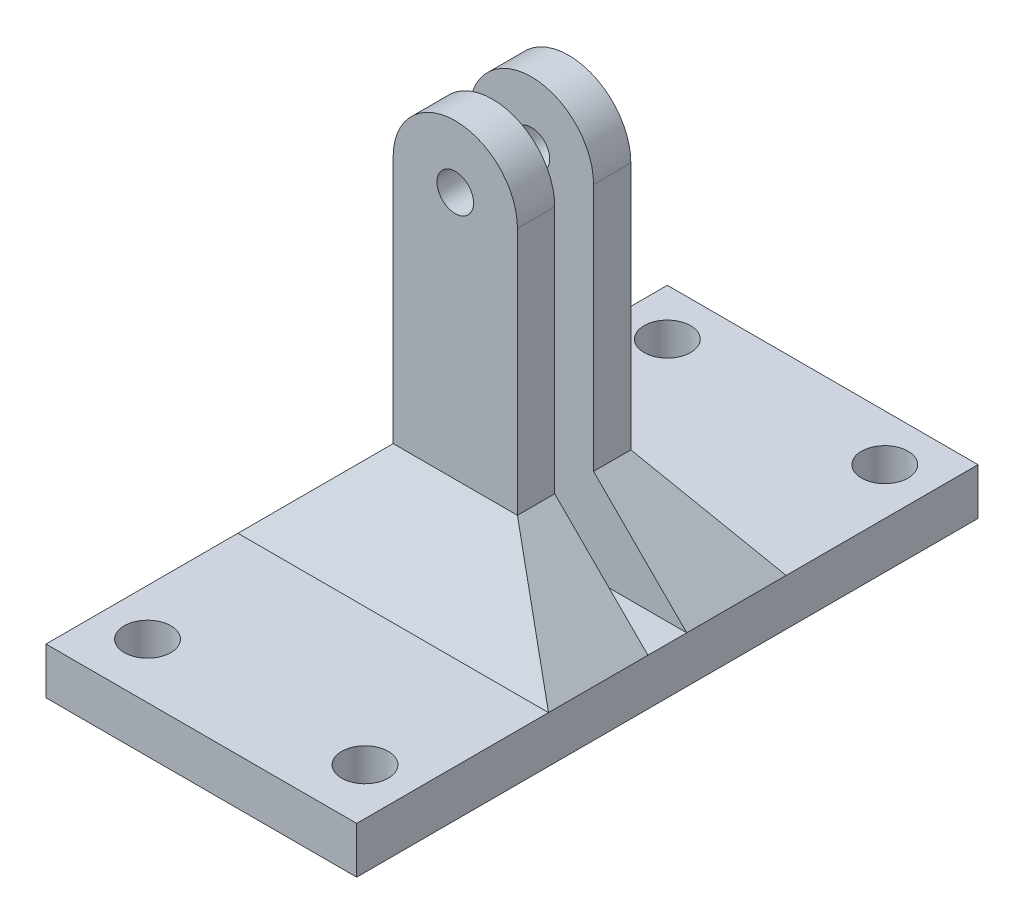
ISO-10303-21;
HEADER;
FILE_DESCRIPTION(('STEP AP214'),'2;1');
FILE_NAME('part.step','',(''),(''),'','','');
FILE_SCHEMA(('AUTOMOTIVE_DESIGN { 1 0 10303 214 1 1 1 1 }'));
ENDSEC;
DATA;
#1=APPLICATION_CONTEXT('core data for automotive mechanical design processes');
#2=APPLICATION_PROTOCOL_DEFINITION('international standard','automotive_design',2000,#1);
#3=PRODUCT_CONTEXT('',#1,'mechanical');
#4=PRODUCT('Part','Part','',(#3));
#5=PRODUCT_RELATED_PRODUCT_CATEGORY('part','',(#4));
#6=PRODUCT_DEFINITION_FORMATION('','',#4);
#7=PRODUCT_DEFINITION_CONTEXT('part definition',#1,'design');
#8=PRODUCT_DEFINITION('design','',#6,#7);
#9=PRODUCT_DEFINITION_SHAPE('','',#8);
#10=(LENGTH_UNIT() NAMED_UNIT(*) SI_UNIT(.MILLI.,.METRE.));
#11=(NAMED_UNIT(*) PLANE_ANGLE_UNIT() SI_UNIT($,.RADIAN.));
#12=(NAMED_UNIT(*) SI_UNIT($,.STERADIAN.) SOLID_ANGLE_UNIT());
#13=UNCERTAINTY_MEASURE_WITH_UNIT(LENGTH_MEASURE(1.E-05),#10,'distance_accuracy_value','');
#14=(GEOMETRIC_REPRESENTATION_CONTEXT(3) GLOBAL_UNCERTAINTY_ASSIGNED_CONTEXT((#13)) GLOBAL_UNIT_ASSIGNED_CONTEXT((#10,
#11,#12)) REPRESENTATION_CONTEXT('',''));
#15=CARTESIAN_POINT('',(0.,0.,0.));
#16=DIRECTION('',(0.,0.,1.));
#17=DIRECTION('',(1.,0.,0.));
#18=AXIS2_PLACEMENT_3D('',#15,#16,#17);
#19=CARTESIAN_POINT('',(0.,0.,-1.25));
#20=DIRECTION('',(0.,0.,-1.));
#21=DIRECTION('',(0.,1.,0.));
#22=AXIS2_PLACEMENT_3D('',#19,#20,#21);
#23=PLANE('',#22);
#24=CARTESIAN_POINT('',(0.,25.,-1.25));
#25=DIRECTION('',(0.,0.,-1.));
#26=DIRECTION('',(0.,1.,0.));
#27=AXIS2_PLACEMENT_3D('',#24,#25,#26);
#28=CIRCLE('',#27,1.17867972849522);
#29=CARTESIAN_POINT('',(0.,26.1786797284952,-1.25));
#30=VERTEX_POINT('',#29);
#31=EDGE_CURVE('E658',#30,#30,#28,.T.);
#32=ORIENTED_EDGE('',*,*,#31,.T.);
#33=EDGE_LOOP('',(#32));
#34=FACE_BOUND('',#33,.T.);
#35=CARTESIAN_POINT('',(0.,25.,-1.25));
#36=DIRECTION('',(0.,0.,-1.));
#37=DIRECTION('',(0.,1.,0.));
#38=AXIS2_PLACEMENT_3D('',#35,#36,#37);
#39=CIRCLE('',#38,4.);
#40=CARTESIAN_POINT('',(-4.,25.,-1.25));
#41=VERTEX_POINT('',#40);
#42=CARTESIAN_POINT('',(4.,25.,-1.25));
#43=VERTEX_POINT('',#42);
#44=EDGE_CURVE('E674',#41,#43,#39,.T.);
#45=ORIENTED_EDGE('',*,*,#44,.F.);
#46=DIRECTION('',(0.,-1.,0.));
#47=VECTOR('',#46,1.);
#48=CARTESIAN_POINT('',(-4.,29.,-1.25));
#49=LINE('',#48,#47);
#50=CARTESIAN_POINT('',(-4.,9.,-1.25));
#51=VERTEX_POINT('',#50);
#52=EDGE_CURVE('E243',#41,#51,#49,.T.);
#53=ORIENTED_EDGE('',*,*,#52,.T.);
#54=DIRECTION('',(0.707106781186547,0.707106781186547,0.));
#55=VECTOR('',#54,1.);
#56=CARTESIAN_POINT('',(-10.,3.,-1.25));
#57=LINE('',#56,#55);
#58=CARTESIAN_POINT('',(-10.,3.,-1.25));
#59=VERTEX_POINT('',#58);
#60=EDGE_CURVE('E453',#59,#51,#57,.T.);
#61=ORIENTED_EDGE('',*,*,#60,.F.);
#62=DIRECTION('',(1.,0.,0.));
#63=VECTOR('',#62,1.);
#64=CARTESIAN_POINT('',(-10.,3.,-1.25));
#65=LINE('',#64,#63);
#66=CARTESIAN_POINT('',(10.,3.,-1.25));
#67=VERTEX_POINT('',#66);
#68=EDGE_CURVE('E515',#59,#67,#65,.T.);
#69=ORIENTED_EDGE('',*,*,#68,.T.);
#70=DIRECTION('',(-0.707106781186547,0.707106781186547,0.));
#71=VECTOR('',#70,1.);
#72=CARTESIAN_POINT('',(10.,3.,-1.25));
#73=LINE('',#72,#71);
#74=CARTESIAN_POINT('',(4.,9.,-1.25));
#75=VERTEX_POINT('',#74);
#76=EDGE_CURVE('E333',#67,#75,#73,.T.);
#77=ORIENTED_EDGE('',*,*,#76,.T.);
#78=DIRECTION('',(0.,-1.,0.));
#79=VECTOR('',#78,1.);
#80=CARTESIAN_POINT('',(4.,29.,-1.25));
#81=LINE('',#80,#79);
#82=EDGE_CURVE('E258',#43,#75,#81,.T.);
#83=ORIENTED_EDGE('',*,*,#82,.F.);
#84=EDGE_LOOP('',(#45,#53,#61,#69,#77,#83));
#85=FACE_BOUND('',#84,.T.);
#86=ADVANCED_FACE('F105',(#34,#85),#23,.F.);
#87=CARTESIAN_POINT('',(0.,0.,1.25));
#88=DIRECTION('',(0.,0.,1.));
#89=DIRECTION('',(0.,1.,0.));
#90=AXIS2_PLACEMENT_3D('',#87,#88,#89);
#91=PLANE('',#90);
#92=CARTESIAN_POINT('',(0.,25.,1.25));
#93=DIRECTION('',(0.,0.,1.));
#94=DIRECTION('',(0.,-1.,0.));
#95=AXIS2_PLACEMENT_3D('',#92,#93,#94);
#96=CIRCLE('',#95,1.17867972849522);
#97=CARTESIAN_POINT('',(0.,23.8213202715048,1.25));
#98=VERTEX_POINT('',#97);
#99=EDGE_CURVE('E245',#98,#98,#96,.T.);
#100=ORIENTED_EDGE('',*,*,#99,.T.);
#101=EDGE_LOOP('',(#100));
#102=FACE_BOUND('',#101,.T.);
#103=DIRECTION('',(0.,-1.,0.));
#104=VECTOR('',#103,1.);
#105=CARTESIAN_POINT('',(-4.,29.,1.25));
#106=LINE('',#105,#104);
#107=CARTESIAN_POINT('',(-4.,25.,1.25));
#108=VERTEX_POINT('',#107);
#109=CARTESIAN_POINT('',(-4.,9.,1.25));
#110=VERTEX_POINT('',#109);
#111=EDGE_CURVE('E110',#108,#110,#106,.T.);
#112=ORIENTED_EDGE('',*,*,#111,.F.);
#113=CARTESIAN_POINT('',(0.,25.,1.25));
#114=DIRECTION('',(0.,0.,1.));
#115=DIRECTION('',(0.,-1.,0.));
#116=AXIS2_PLACEMENT_3D('',#113,#114,#115);
#117=CIRCLE('',#116,4.);
#118=CARTESIAN_POINT('',(4.,25.,1.25));
#119=VERTEX_POINT('',#118);
#120=EDGE_CURVE('E236',#119,#108,#117,.T.);
#121=ORIENTED_EDGE('',*,*,#120,.F.);
#122=DIRECTION('',(0.,-1.,0.));
#123=VECTOR('',#122,1.);
#124=CARTESIAN_POINT('',(4.,29.,1.25));
#125=LINE('',#124,#123);
#126=CARTESIAN_POINT('',(4.,9.,1.25));
#127=VERTEX_POINT('',#126);
#128=EDGE_CURVE('E260',#119,#127,#125,.T.);
#129=ORIENTED_EDGE('',*,*,#128,.T.);
#130=DIRECTION('',(-0.707106781186547,0.707106781186547,0.));
#131=VECTOR('',#130,1.);
#132=CARTESIAN_POINT('',(10.,3.,1.25));
#133=LINE('',#132,#131);
#134=CARTESIAN_POINT('',(10.,3.,1.25));
#135=VERTEX_POINT('',#134);
#136=EDGE_CURVE('E401',#135,#127,#133,.T.);
#137=ORIENTED_EDGE('',*,*,#136,.F.);
#138=DIRECTION('',(1.,0.,0.));
#139=VECTOR('',#138,1.);
#140=CARTESIAN_POINT('',(0.,3.,1.25));
#141=LINE('',#140,#139);
#142=CARTESIAN_POINT('',(-10.,3.,1.25));
#143=VERTEX_POINT('',#142);
#144=EDGE_CURVE('E134',#143,#135,#141,.T.);
#145=ORIENTED_EDGE('',*,*,#144,.F.);
#146=DIRECTION('',(0.707106781186547,0.707106781186547,0.));
#147=VECTOR('',#146,1.);
#148=CARTESIAN_POINT('',(-10.,3.,1.25));
#149=LINE('',#148,#147);
#150=EDGE_CURVE('E407',#143,#110,#149,.T.);
#151=ORIENTED_EDGE('',*,*,#150,.T.);
#152=EDGE_LOOP('',(#112,#121,#129,#137,#145,#151));
#153=FACE_BOUND('',#152,.T.);
#154=ADVANCED_FACE('F372',(#102,#153),#91,.F.);
#155=CARTESIAN_POINT('',(-4.,29.,3.65));
#156=DIRECTION('',(0.,0.,-1.));
#157=DIRECTION('',(-1.,0.,0.));
#158=AXIS2_PLACEMENT_3D('',#155,#156,#157);
#159=PLANE('',#158);
#160=CARTESIAN_POINT('',(0.,25.,3.65));
#161=DIRECTION('',(0.,0.,1.));
#162=DIRECTION('',(1.,0.,0.));
#163=AXIS2_PLACEMENT_3D('',#160,#161,#162);
#164=CIRCLE('',#163,1.17867972849522);
#165=CARTESIAN_POINT('',(1.17867972849522,25.,3.65));
#166=VERTEX_POINT('',#165);
#167=EDGE_CURVE('E770',#166,#166,#164,.T.);
#168=ORIENTED_EDGE('',*,*,#167,.F.);
#169=EDGE_LOOP('',(#168));
#170=FACE_BOUND('',#169,.T.);
#171=CARTESIAN_POINT('',(0.,25.,3.65));
#172=DIRECTION('',(0.,0.,1.));
#173=DIRECTION('',(1.,0.,0.));
#174=AXIS2_PLACEMENT_3D('',#171,#172,#173);
#175=CIRCLE('',#174,4.);
#176=CARTESIAN_POINT('',(4.,25.,3.65));
#177=VERTEX_POINT('',#176);
#178=CARTESIAN_POINT('',(-4.,25.,3.65));
#179=VERTEX_POINT('',#178);
#180=EDGE_CURVE('E661',#177,#179,#175,.T.);
#181=ORIENTED_EDGE('',*,*,#180,.T.);
#182=DIRECTION('',(0.,-1.,0.));
#183=VECTOR('',#182,1.);
#184=CARTESIAN_POINT('',(-4.,29.,3.65));
#185=LINE('',#184,#183);
#186=CARTESIAN_POINT('',(-4.,9.,3.65));
#187=VERTEX_POINT('',#186);
#188=EDGE_CURVE('E265',#179,#187,#185,.T.);
#189=ORIENTED_EDGE('',*,*,#188,.T.);
#190=CARTESIAN_POINT('',(-4.,9.,3.65));
#191=DIRECTION('',(1.,0.,0.));
#192=VECTOR('',#191,1.);
#193=LINE('',#190,#192);
#194=CARTESIAN_POINT('',(4.,9.,3.65));
#195=VERTEX_POINT('',#194);
#196=EDGE_CURVE('E398',#187,#195,#193,.T.);
#197=ORIENTED_EDGE('',*,*,#196,.T.);
#198=DIRECTION('',(0.,-1.,0.));
#199=VECTOR('',#198,1.);
#200=CARTESIAN_POINT('',(4.,29.,3.65));
#201=LINE('',#200,#199);
#202=EDGE_CURVE('E343',#177,#195,#201,.T.);
#203=ORIENTED_EDGE('',*,*,#202,.F.);
#204=EDGE_LOOP('',(#181,#189,#197,#203));
#205=FACE_BOUND('',#204,.T.);
#206=ADVANCED_FACE('F290',(#170,#205),#159,.F.);
#207=CARTESIAN_POINT('',(-4.,29.,-3.65));
#208=DIRECTION('',(0.,0.,1.));
#209=DIRECTION('',(1.,0.,0.));
#210=AXIS2_PLACEMENT_3D('',#207,#208,#209);
#211=PLANE('',#210);
#212=CARTESIAN_POINT('',(0.,25.,-3.65));
#213=DIRECTION('',(0.,0.,1.));
#214=DIRECTION('',(1.,0.,0.));
#215=AXIS2_PLACEMENT_3D('',#212,#213,#214);
#216=CIRCLE('',#215,1.17867972849522);
#217=CARTESIAN_POINT('',(1.17867972849522,25.,-3.65));
#218=VERTEX_POINT('',#217);
#219=EDGE_CURVE('E766',#218,#218,#216,.F.);
#220=ORIENTED_EDGE('',*,*,#219,.F.);
#221=EDGE_LOOP('',(#220));
#222=FACE_BOUND('',#221,.T.);
#223=DIRECTION('',(0.,-1.,0.));
#224=VECTOR('',#223,1.);
#225=CARTESIAN_POINT('',(-4.,29.,-3.65));
#226=LINE('',#225,#224);
#227=CARTESIAN_POINT('',(-4.,25.,-3.65));
#228=VERTEX_POINT('',#227);
#229=CARTESIAN_POINT('',(-4.,9.,-3.65));
#230=VERTEX_POINT('',#229);
#231=EDGE_CURVE('E241',#228,#230,#226,.T.);
#232=ORIENTED_EDGE('',*,*,#231,.F.);
#233=CARTESIAN_POINT('',(0.,25.,-3.65));
#234=DIRECTION('',(0.,0.,1.));
#235=DIRECTION('',(1.,0.,0.));
#236=AXIS2_PLACEMENT_3D('',#233,#234,#235);
#237=CIRCLE('',#236,4.);
#238=CARTESIAN_POINT('',(4.,25.,-3.65));
#239=VERTEX_POINT('',#238);
#240=EDGE_CURVE('E225',#228,#239,#237,.F.);
#241=ORIENTED_EDGE('',*,*,#240,.T.);
#242=DIRECTION('',(0.,-1.,0.));
#243=VECTOR('',#242,1.);
#244=CARTESIAN_POINT('',(4.,29.,-3.65));
#245=LINE('',#244,#243);
#246=CARTESIAN_POINT('',(4.,9.,-3.65));
#247=VERTEX_POINT('',#246);
#248=EDGE_CURVE('E254',#239,#247,#245,.T.);
#249=ORIENTED_EDGE('',*,*,#248,.T.);
#250=DIRECTION('',(-1.,0.,0.));
#251=VECTOR('',#250,1.);
#252=CARTESIAN_POINT('',(-4.,9.,-3.65));
#253=LINE('',#252,#251);
#254=EDGE_CURVE('E251',#247,#230,#253,.T.);
#255=ORIENTED_EDGE('',*,*,#254,.T.);
#256=EDGE_LOOP('',(#232,#241,#249,#255));
#257=FACE_BOUND('',#256,.T.);
#258=ADVANCED_FACE('F249',(#222,#257),#211,.F.);
#259=CARTESIAN_POINT('',(-4.,29.,1.25));
#260=DIRECTION('',(1.,0.,0.));
#261=DIRECTION('',(0.,0.,-1.));
#262=AXIS2_PLACEMENT_3D('',#259,#260,#261);
#263=PLANE('',#262);
#264=DIRECTION('',(0.,0.,1.));
#265=VECTOR('',#264,1.);
#266=CARTESIAN_POINT('',(-4.,25.,-9.30685424949238));
#267=LINE('',#266,#265);
#268=EDGE_CURVE('E246',#108,#179,#267,.T.);
#269=ORIENTED_EDGE('',*,*,#268,.F.);
#270=ORIENTED_EDGE('',*,*,#111,.T.);
#271=CARTESIAN_POINT('',(-4.,9.,1.25));
#272=DIRECTION('',(0.,0.,1.));
#273=VECTOR('',#272,1.);
#274=LINE('',#271,#273);
#275=EDGE_CURVE('E356',#110,#187,#274,.T.);
#276=ORIENTED_EDGE('',*,*,#275,.T.);
#277=ORIENTED_EDGE('',*,*,#188,.F.);
#278=EDGE_LOOP('',(#269,#270,#276,#277));
#279=FACE_BOUND('',#278,.T.);
#280=ADVANCED_FACE('F289',(#279),#263,.F.);
#281=CARTESIAN_POINT('',(-4.,29.,-1.25));
#282=DIRECTION('',(1.,0.,0.));
#283=DIRECTION('',(0.,0.,-1.));
#284=AXIS2_PLACEMENT_3D('',#281,#282,#283);
#285=PLANE('',#284);
#286=EDGE_CURVE('E228',#228,#41,#267,.T.);
#287=ORIENTED_EDGE('',*,*,#286,.F.);
#288=ORIENTED_EDGE('',*,*,#231,.T.);
#289=DIRECTION('',(0.,0.,1.));
#290=VECTOR('',#289,1.);
#291=CARTESIAN_POINT('',(-4.,9.,-3.65));
#292=LINE('',#291,#290);
#293=EDGE_CURVE('E316',#230,#51,#292,.T.);
#294=ORIENTED_EDGE('',*,*,#293,.T.);
#295=ORIENTED_EDGE('',*,*,#52,.F.);
#296=EDGE_LOOP('',(#287,#288,#294,#295));
#297=FACE_BOUND('',#296,.T.);
#298=ADVANCED_FACE('F239',(#297),#285,.F.);
#299=CARTESIAN_POINT('',(0.,3.,0.));
#300=DIRECTION('',(0.,-1.,0.));
#301=DIRECTION('',(0.,0.,-1.));
#302=AXIS2_PLACEMENT_3D('',#299,#300,#301);
#303=PLANE('',#302);
#304=CARTESIAN_POINT('',(7.,3.,16.4635901953477));
#305=DIRECTION('',(0.,1.,0.));
#306=DIRECTION('',(0.,0.,1.));
#307=AXIS2_PLACEMENT_3D('',#304,#305,#306);
#308=CIRCLE('',#307,1.5);
#309=CARTESIAN_POINT('',(7.,3.,17.9635901953477));
#310=VERTEX_POINT('',#309);
#311=EDGE_CURVE('E732',#310,#310,#308,.T.);
#312=ORIENTED_EDGE('',*,*,#311,.F.);
#313=EDGE_LOOP('',(#312));
#314=FACE_BOUND('',#313,.T.);
#315=CARTESIAN_POINT('',(-7.,3.,16.4635901953477));
#316=DIRECTION('',(0.,1.,0.));
#317=DIRECTION('',(0.,0.,1.));
#318=AXIS2_PLACEMENT_3D('',#315,#316,#317);
#319=CIRCLE('',#318,1.5);
#320=CARTESIAN_POINT('',(-7.,3.,17.9635901953477));
#321=VERTEX_POINT('',#320);
#322=EDGE_CURVE('E735',#321,#321,#319,.T.);
#323=ORIENTED_EDGE('',*,*,#322,.F.);
#324=EDGE_LOOP('',(#323));
#325=FACE_BOUND('',#324,.T.);
#326=CARTESIAN_POINT('',(10.,3.,7.65));
#327=DIRECTION('',(-1.,0.,0.));
#328=VECTOR('',#327,1.);
#329=LINE('',#326,#328);
#330=CARTESIAN_POINT('',(10.,3.,7.65));
#331=VERTEX_POINT('',#330);
#332=CARTESIAN_POINT('',(-10.,3.,7.65));
#333=VERTEX_POINT('',#332);
#334=EDGE_CURVE('E125',#331,#333,#329,.T.);
#335=ORIENTED_EDGE('',*,*,#334,.T.);
#336=DIRECTION('',(0.,0.,1.));
#337=VECTOR('',#336,1.);
#338=CARTESIAN_POINT('',(-10.,3.,20.));
#339=LINE('',#338,#337);
#340=CARTESIAN_POINT('',(-10.,3.,20.));
#341=VERTEX_POINT('',#340);
#342=EDGE_CURVE('E547',#333,#341,#339,.T.);
#343=ORIENTED_EDGE('',*,*,#342,.T.);
#344=DIRECTION('',(1.,0.,0.));
#345=VECTOR('',#344,1.);
#346=CARTESIAN_POINT('',(-10.,3.,20.));
#347=LINE('',#346,#345);
#348=CARTESIAN_POINT('',(10.,3.,20.));
#349=VERTEX_POINT('',#348);
#350=EDGE_CURVE('E553',#341,#349,#347,.T.);
#351=ORIENTED_EDGE('',*,*,#350,.T.);
#352=DIRECTION('',(0.,0.,-1.));
#353=VECTOR('',#352,1.);
#354=CARTESIAN_POINT('',(10.,3.,20.));
#355=LINE('',#354,#353);
#356=EDGE_CURVE('E545',#349,#331,#355,.T.);
#357=ORIENTED_EDGE('',*,*,#356,.T.);
#358=EDGE_LOOP('',(#335,#343,#351,#357));
#359=FACE_BOUND('',#358,.T.);
#360=ADVANCED_FACE('F607',(#314,#325,#359),#303,.F.);
#361=ORIENTED_EDGE('',*,*,#144,.T.);
#362=EDGE_CURVE('E542',#135,#67,#355,.T.);
#363=ORIENTED_EDGE('',*,*,#362,.T.);
#364=ORIENTED_EDGE('',*,*,#68,.F.);
#365=EDGE_CURVE('E528',#59,#143,#339,.T.);
#366=ORIENTED_EDGE('',*,*,#365,.T.);
#367=EDGE_LOOP('',(#361,#363,#364,#366));
#368=FACE_BOUND('',#367,.T.);
#369=ADVANCED_FACE('F714',(#368),#303,.F.);
#370=CARTESIAN_POINT('',(-7.,3.,-17.));
#371=DIRECTION('',(0.,1.,0.));
#372=DIRECTION('',(0.,0.,1.));
#373=AXIS2_PLACEMENT_3D('',#370,#371,#372);
#374=CIRCLE('',#373,1.5);
#375=CARTESIAN_POINT('',(-7.,3.,-15.5));
#376=VERTEX_POINT('',#375);
#377=EDGE_CURVE('E752',#376,#376,#374,.T.);
#378=ORIENTED_EDGE('',*,*,#377,.F.);
#379=EDGE_LOOP('',(#378));
#380=FACE_BOUND('',#379,.T.);
#381=CARTESIAN_POINT('',(7.,3.,-17.));
#382=DIRECTION('',(0.,1.,0.));
#383=DIRECTION('',(0.,0.,1.));
#384=AXIS2_PLACEMENT_3D('',#381,#382,#383);
#385=CIRCLE('',#384,1.5);
#386=CARTESIAN_POINT('',(7.,3.,-15.5));
#387=VERTEX_POINT('',#386);
#388=EDGE_CURVE('E755',#387,#387,#385,.T.);
#389=ORIENTED_EDGE('',*,*,#388,.F.);
#390=EDGE_LOOP('',(#389));
#391=FACE_BOUND('',#390,.T.);
#392=CARTESIAN_POINT('',(-10.,3.,-20.));
#393=VERTEX_POINT('',#392);
#394=CARTESIAN_POINT('',(-10.,3.,-7.65));
#395=VERTEX_POINT('',#394);
#396=EDGE_CURVE('E557',#393,#395,#339,.T.);
#397=ORIENTED_EDGE('',*,*,#396,.T.);
#398=DIRECTION('',(-1.,0.,0.));
#399=VECTOR('',#398,1.);
#400=CARTESIAN_POINT('',(-10.,3.,-7.65));
#401=LINE('',#400,#399);
#402=CARTESIAN_POINT('',(10.,3.,-7.65));
#403=VERTEX_POINT('',#402);
#404=EDGE_CURVE('E459',#403,#395,#401,.T.);
#405=ORIENTED_EDGE('',*,*,#404,.F.);
#406=CARTESIAN_POINT('',(10.,3.,-20.));
#407=VERTEX_POINT('',#406);
#408=EDGE_CURVE('E546',#403,#407,#355,.T.);
#409=ORIENTED_EDGE('',*,*,#408,.T.);
#410=DIRECTION('',(-1.,0.,0.));
#411=VECTOR('',#410,1.);
#412=CARTESIAN_POINT('',(-10.,3.,-20.));
#413=LINE('',#412,#411);
#414=EDGE_CURVE('E549',#407,#393,#413,.T.);
#415=ORIENTED_EDGE('',*,*,#414,.T.);
#416=EDGE_LOOP('',(#397,#405,#409,#415));
#417=FACE_BOUND('',#416,.T.);
#418=ADVANCED_FACE('F648',(#380,#391,#417),#303,.F.);
#419=CARTESIAN_POINT('',(10.,3.,20.));
#420=DIRECTION('',(-1.,0.,0.));
#421=DIRECTION('',(0.,0.,1.));
#422=AXIS2_PLACEMENT_3D('',#419,#420,#421);
#423=PLANE('',#422);
#424=DIRECTION('',(0.,0.,-1.));
#425=VECTOR('',#424,1.);
#426=CARTESIAN_POINT('',(10.,0.,20.));
#427=LINE('',#426,#425);
#428=CARTESIAN_POINT('',(10.,0.,20.));
#429=VERTEX_POINT('',#428);
#430=CARTESIAN_POINT('',(10.,0.,-20.));
#431=VERTEX_POINT('',#430);
#432=EDGE_CURVE('E584',#429,#431,#427,.T.);
#433=ORIENTED_EDGE('',*,*,#432,.T.);
#434=DIRECTION('',(0.,-1.,0.));
#435=VECTOR('',#434,1.);
#436=CARTESIAN_POINT('',(10.,3.,-20.));
#437=LINE('',#436,#435);
#438=EDGE_CURVE('E12',#407,#431,#437,.T.);
#439=ORIENTED_EDGE('',*,*,#438,.F.);
#440=ORIENTED_EDGE('',*,*,#408,.F.);
#441=DIRECTION('',(0.,0.,-1.));
#442=VECTOR('',#441,1.);
#443=CARTESIAN_POINT('',(10.,3.,-7.65));
#444=LINE('',#443,#442);
#445=EDGE_CURVE('E519',#67,#403,#444,.T.);
#446=ORIENTED_EDGE('',*,*,#445,.F.);
#447=ORIENTED_EDGE('',*,*,#362,.F.);
#448=CARTESIAN_POINT('',(10.,3.,7.65));
#449=DIRECTION('',(0.,0.,-1.));
#450=VECTOR('',#449,1.);
#451=LINE('',#448,#450);
#452=EDGE_CURVE('E403',#331,#135,#451,.T.);
#453=ORIENTED_EDGE('',*,*,#452,.F.);
#454=ORIENTED_EDGE('',*,*,#356,.F.);
#455=DIRECTION('',(0.,-1.,0.));
#456=VECTOR('',#455,1.);
#457=CARTESIAN_POINT('',(10.,3.,20.));
#458=LINE('',#457,#456);
#459=EDGE_CURVE('E573',#349,#429,#458,.T.);
#460=ORIENTED_EDGE('',*,*,#459,.T.);
#461=EDGE_LOOP('',(#433,#439,#440,#446,#447,#453,#454,#460));
#462=FACE_BOUND('',#461,.T.);
#463=ADVANCED_FACE('F107',(#462),#423,.F.);
#464=CARTESIAN_POINT('',(-10.,3.,-20.));
#465=DIRECTION('',(0.,0.,1.));
#466=DIRECTION('',(1.,0.,0.));
#467=AXIS2_PLACEMENT_3D('',#464,#465,#466);
#468=PLANE('',#467);
#469=DIRECTION('',(-1.,0.,0.));
#470=VECTOR('',#469,1.);
#471=CARTESIAN_POINT('',(-10.,0.,-20.));
#472=LINE('',#471,#470);
#473=CARTESIAN_POINT('',(-10.,0.,-20.));
#474=VERTEX_POINT('',#473);
#475=EDGE_CURVE('E582',#431,#474,#472,.T.);
#476=ORIENTED_EDGE('',*,*,#475,.T.);
#477=DIRECTION('',(0.,-1.,0.));
#478=VECTOR('',#477,1.);
#479=CARTESIAN_POINT('',(-10.,3.,-20.));
#480=LINE('',#479,#478);
#481=EDGE_CURVE('E117',#393,#474,#480,.T.);
#482=ORIENTED_EDGE('',*,*,#481,.F.);
#483=ORIENTED_EDGE('',*,*,#414,.F.);
#484=ORIENTED_EDGE('',*,*,#438,.T.);
#485=EDGE_LOOP('',(#476,#482,#483,#484));
#486=FACE_BOUND('',#485,.T.);
#487=ADVANCED_FACE('F600',(#486),#468,.F.);
#488=CARTESIAN_POINT('',(-10.,3.,20.));
#489=DIRECTION('',(1.,0.,0.));
#490=DIRECTION('',(0.,0.,-1.));
#491=AXIS2_PLACEMENT_3D('',#488,#489,#490);
#492=PLANE('',#491);
#493=DIRECTION('',(0.,0.,1.));
#494=VECTOR('',#493,1.);
#495=CARTESIAN_POINT('',(-10.,0.,20.));
#496=LINE('',#495,#494);
#497=CARTESIAN_POINT('',(-10.,0.,20.));
#498=VERTEX_POINT('',#497);
#499=EDGE_CURVE('E579',#474,#498,#496,.T.);
#500=ORIENTED_EDGE('',*,*,#499,.T.);
#501=DIRECTION('',(0.,-1.,0.));
#502=VECTOR('',#501,1.);
#503=CARTESIAN_POINT('',(-10.,3.,20.));
#504=LINE('',#503,#502);
#505=EDGE_CURVE('E569',#341,#498,#504,.T.);
#506=ORIENTED_EDGE('',*,*,#505,.F.);
#507=ORIENTED_EDGE('',*,*,#342,.F.);
#508=CARTESIAN_POINT('',(-10.,3.,1.25000000000001));
#509=DIRECTION('',(0.,0.,1.));
#510=VECTOR('',#509,1.);
#511=LINE('',#508,#510);
#512=EDGE_CURVE('E628',#143,#333,#511,.T.);
#513=ORIENTED_EDGE('',*,*,#512,.F.);
#514=ORIENTED_EDGE('',*,*,#365,.F.);
#515=DIRECTION('',(0.,0.,1.));
#516=VECTOR('',#515,1.);
#517=CARTESIAN_POINT('',(-10.,3.,-7.65));
#518=LINE('',#517,#516);
#519=EDGE_CURVE('E520',#395,#59,#518,.T.);
#520=ORIENTED_EDGE('',*,*,#519,.F.);
#521=ORIENTED_EDGE('',*,*,#396,.F.);
#522=ORIENTED_EDGE('',*,*,#481,.T.);
#523=EDGE_LOOP('',(#500,#506,#507,#513,#514,#520,#521,#522));
#524=FACE_BOUND('',#523,.T.);
#525=ADVANCED_FACE('F633',(#524),#492,.F.);
#526=CARTESIAN_POINT('',(-10.,3.,20.));
#527=DIRECTION('',(0.,0.,-1.));
#528=DIRECTION('',(-1.,0.,0.));
#529=AXIS2_PLACEMENT_3D('',#526,#527,#528);
#530=PLANE('',#529);
#531=DIRECTION('',(1.,0.,0.));
#532=VECTOR('',#531,1.);
#533=CARTESIAN_POINT('',(-10.,0.,20.));
#534=LINE('',#533,#532);
#535=EDGE_CURVE('E563',#498,#429,#534,.T.);
#536=ORIENTED_EDGE('',*,*,#535,.T.);
#537=ORIENTED_EDGE('',*,*,#459,.F.);
#538=ORIENTED_EDGE('',*,*,#350,.F.);
#539=ORIENTED_EDGE('',*,*,#505,.T.);
#540=EDGE_LOOP('',(#536,#537,#538,#539));
#541=FACE_BOUND('',#540,.T.);
#542=ADVANCED_FACE('F610',(#541),#530,.F.);
#543=CARTESIAN_POINT('',(0.,0.,0.));
#544=DIRECTION('',(0.,-1.,0.));
#545=DIRECTION('',(0.,0.,-1.));
#546=AXIS2_PLACEMENT_3D('',#543,#544,#545);
#547=PLANE('',#546);
#548=CARTESIAN_POINT('',(-7.,0.,-17.));
#549=DIRECTION('',(0.,-1.,0.));
#550=DIRECTION('',(0.,0.,-1.));
#551=AXIS2_PLACEMENT_3D('',#548,#549,#550);
#552=CIRCLE('',#551,1.5);
#553=CARTESIAN_POINT('',(-7.,0.,-18.5));
#554=VERTEX_POINT('',#553);
#555=EDGE_CURVE('E748',#554,#554,#552,.F.);
#556=ORIENTED_EDGE('',*,*,#555,.T.);
#557=EDGE_LOOP('',(#556));
#558=FACE_BOUND('',#557,.T.);
#559=CARTESIAN_POINT('',(7.,0.,16.4635901953477));
#560=DIRECTION('',(0.,-1.,0.));
#561=DIRECTION('',(0.,0.,-1.));
#562=AXIS2_PLACEMENT_3D('',#559,#560,#561);
#563=CIRCLE('',#562,1.5);
#564=CARTESIAN_POINT('',(7.,0.,14.9635901953477));
#565=VERTEX_POINT('',#564);
#566=EDGE_CURVE('E738',#565,#565,#563,.F.);
#567=ORIENTED_EDGE('',*,*,#566,.T.);
#568=EDGE_LOOP('',(#567));
#569=FACE_BOUND('',#568,.T.);
#570=CARTESIAN_POINT('',(-7.,0.,16.4635901953477));
#571=DIRECTION('',(0.,-1.,0.));
#572=DIRECTION('',(0.,0.,-1.));
#573=AXIS2_PLACEMENT_3D('',#570,#571,#572);
#574=CIRCLE('',#573,1.5);
#575=CARTESIAN_POINT('',(-7.,0.,14.9635901953477));
#576=VERTEX_POINT('',#575);
#577=EDGE_CURVE('E739',#576,#576,#574,.F.);
#578=ORIENTED_EDGE('',*,*,#577,.T.);
#579=EDGE_LOOP('',(#578));
#580=FACE_BOUND('',#579,.T.);
#581=CARTESIAN_POINT('',(7.,0.,-17.));
#582=DIRECTION('',(0.,-1.,0.));
#583=DIRECTION('',(0.,0.,-1.));
#584=AXIS2_PLACEMENT_3D('',#581,#582,#583);
#585=CIRCLE('',#584,1.5);
#586=CARTESIAN_POINT('',(7.,0.,-18.5));
#587=VERTEX_POINT('',#586);
#588=EDGE_CURVE('E762',#587,#587,#585,.F.);
#589=ORIENTED_EDGE('',*,*,#588,.T.);
#590=EDGE_LOOP('',(#589));
#591=FACE_BOUND('',#590,.T.);
#592=ORIENTED_EDGE('',*,*,#432,.F.);
#593=ORIENTED_EDGE('',*,*,#535,.F.);
#594=ORIENTED_EDGE('',*,*,#499,.F.);
#595=ORIENTED_EDGE('',*,*,#475,.F.);
#596=EDGE_LOOP('',(#592,#593,#594,#595));
#597=FACE_BOUND('',#596,.T.);
#598=ADVANCED_FACE('F490',(#558,#569,#580,#591,#597),#547,.T.);
#599=CARTESIAN_POINT('',(0.,4.45384615384616,-6.68076923076923));
#600=DIRECTION('',(0.,-0.554700196225229,0.832050294337844));
#601=DIRECTION('',(0.,-0.832050294337843,-0.554700196225229));
#602=AXIS2_PLACEMENT_3D('',#599,#600,#601);
#603=PLANE('',#602);
#604=DIRECTION('',(0.639602149066831,0.639602149066831,0.426401432711221));
#605=VECTOR('',#604,1.);
#606=CARTESIAN_POINT('',(-10.,3.,-7.65));
#607=LINE('',#606,#605);
#608=EDGE_CURVE('E454',#395,#230,#607,.T.);
#609=ORIENTED_EDGE('',*,*,#608,.T.);
#610=ORIENTED_EDGE('',*,*,#254,.F.);
#611=DIRECTION('',(-0.639602149066831,0.639602149066831,0.426401432711221));
#612=VECTOR('',#611,1.);
#613=CARTESIAN_POINT('',(10.,3.,-7.65));
#614=LINE('',#613,#612);
#615=EDGE_CURVE('E444',#403,#247,#614,.T.);
#616=ORIENTED_EDGE('',*,*,#615,.F.);
#617=ORIENTED_EDGE('',*,*,#404,.T.);
#618=EDGE_LOOP('',(#609,#610,#616,#617));
#619=FACE_BOUND('',#618,.T.);
#620=ADVANCED_FACE('F481',(#619),#603,.F.);
#621=CARTESIAN_POINT('',(6.5,6.5,0.));
#622=DIRECTION('',(-0.707106781186548,-0.707106781186548,0.));
#623=DIRECTION('',(0.707106781186547,-0.707106781186548,0.));
#624=AXIS2_PLACEMENT_3D('',#621,#622,#623);
#625=PLANE('',#624);
#626=ORIENTED_EDGE('',*,*,#615,.T.);
#627=DIRECTION('',(0.,0.,-1.));
#628=VECTOR('',#627,1.);
#629=CARTESIAN_POINT('',(4.,9.,-3.65));
#630=LINE('',#629,#628);
#631=EDGE_CURVE('E307',#75,#247,#630,.T.);
#632=ORIENTED_EDGE('',*,*,#631,.F.);
#633=ORIENTED_EDGE('',*,*,#76,.F.);
#634=ORIENTED_EDGE('',*,*,#445,.T.);
#635=EDGE_LOOP('',(#626,#632,#633,#634));
#636=FACE_BOUND('',#635,.T.);
#637=ADVANCED_FACE('F489',(#636),#625,.F.);
#638=CARTESIAN_POINT('',(-6.5,6.5,0.));
#639=DIRECTION('',(0.707106781186548,-0.707106781186548,0.));
#640=DIRECTION('',(0.707106781186548,0.707106781186548,0.));
#641=AXIS2_PLACEMENT_3D('',#638,#639,#640);
#642=PLANE('',#641);
#643=ORIENTED_EDGE('',*,*,#60,.T.);
#644=ORIENTED_EDGE('',*,*,#293,.F.);
#645=ORIENTED_EDGE('',*,*,#608,.F.);
#646=ORIENTED_EDGE('',*,*,#519,.T.);
#647=EDGE_LOOP('',(#643,#644,#645,#646));
#648=FACE_BOUND('',#647,.T.);
#649=ADVANCED_FACE('F494',(#648),#642,.F.);
#650=CARTESIAN_POINT('',(0.,4.45384615384616,6.68076923076923));
#651=DIRECTION('',(0.,-0.554700196225229,-0.832050294337844));
#652=DIRECTION('',(0.,-0.832050294337843,0.554700196225229));
#653=AXIS2_PLACEMENT_3D('',#650,#651,#652);
#654=PLANE('',#653);
#655=DIRECTION('',(0.639602149066831,0.639602149066831,-0.426401432711221));
#656=VECTOR('',#655,1.);
#657=CARTESIAN_POINT('',(-10.,3.,7.65));
#658=LINE('',#657,#656);
#659=EDGE_CURVE('E691',#333,#187,#658,.T.);
#660=ORIENTED_EDGE('',*,*,#659,.F.);
#661=ORIENTED_EDGE('',*,*,#334,.F.);
#662=DIRECTION('',(-0.639602149066831,0.639602149066831,-0.426401432711221));
#663=VECTOR('',#662,1.);
#664=CARTESIAN_POINT('',(10.,3.,7.65));
#665=LINE('',#664,#663);
#666=EDGE_CURVE('E412',#331,#195,#665,.T.);
#667=ORIENTED_EDGE('',*,*,#666,.T.);
#668=ORIENTED_EDGE('',*,*,#196,.F.);
#669=EDGE_LOOP('',(#660,#661,#667,#668));
#670=FACE_BOUND('',#669,.T.);
#671=ADVANCED_FACE('F434',(#670),#654,.F.);
#672=CARTESIAN_POINT('',(6.5,6.5,0.));
#673=DIRECTION('',(-0.707106781186548,-0.707106781186548,0.));
#674=DIRECTION('',(0.707106781186547,-0.707106781186548,0.));
#675=AXIS2_PLACEMENT_3D('',#672,#673,#674);
#676=PLANE('',#675);
#677=ORIENTED_EDGE('',*,*,#666,.F.);
#678=ORIENTED_EDGE('',*,*,#452,.T.);
#679=ORIENTED_EDGE('',*,*,#136,.T.);
#680=CARTESIAN_POINT('',(4.,9.,3.65));
#681=DIRECTION('',(0.,0.,-1.));
#682=VECTOR('',#681,1.);
#683=LINE('',#680,#682);
#684=EDGE_CURVE('E390',#195,#127,#683,.T.);
#685=ORIENTED_EDGE('',*,*,#684,.F.);
#686=EDGE_LOOP('',(#677,#678,#679,#685));
#687=FACE_BOUND('',#686,.T.);
#688=ADVANCED_FACE('F402',(#687),#676,.F.);
#689=CARTESIAN_POINT('',(-6.5,6.5,0.));
#690=DIRECTION('',(0.707106781186548,-0.707106781186548,0.));
#691=DIRECTION('',(0.707106781186548,0.707106781186548,0.));
#692=AXIS2_PLACEMENT_3D('',#689,#690,#691);
#693=PLANE('',#692);
#694=ORIENTED_EDGE('',*,*,#150,.F.);
#695=ORIENTED_EDGE('',*,*,#512,.T.);
#696=ORIENTED_EDGE('',*,*,#659,.T.);
#697=ORIENTED_EDGE('',*,*,#275,.F.);
#698=EDGE_LOOP('',(#694,#695,#696,#697));
#699=FACE_BOUND('',#698,.T.);
#700=ADVANCED_FACE('F433',(#699),#693,.F.);
#701=CARTESIAN_POINT('',(4.,29.,1.25));
#702=DIRECTION('',(-1.,0.,0.));
#703=DIRECTION('',(0.,0.,1.));
#704=AXIS2_PLACEMENT_3D('',#701,#702,#703);
#705=PLANE('',#704);
#706=ORIENTED_EDGE('',*,*,#128,.F.);
#707=DIRECTION('',(0.,0.,1.));
#708=VECTOR('',#707,1.);
#709=CARTESIAN_POINT('',(4.,25.,-9.30685424949238));
#710=LINE('',#709,#708);
#711=EDGE_CURVE('E665',#119,#177,#710,.T.);
#712=ORIENTED_EDGE('',*,*,#711,.T.);
#713=ORIENTED_EDGE('',*,*,#202,.T.);
#714=ORIENTED_EDGE('',*,*,#684,.T.);
#715=EDGE_LOOP('',(#706,#712,#713,#714));
#716=FACE_BOUND('',#715,.T.);
#717=ADVANCED_FACE('F297',(#716),#705,.F.);
#718=CARTESIAN_POINT('',(4.,29.,-1.25));
#719=DIRECTION('',(-1.,0.,0.));
#720=DIRECTION('',(0.,0.,1.));
#721=AXIS2_PLACEMENT_3D('',#718,#719,#720);
#722=PLANE('',#721);
#723=ORIENTED_EDGE('',*,*,#248,.F.);
#724=EDGE_CURVE('E231',#239,#43,#710,.T.);
#725=ORIENTED_EDGE('',*,*,#724,.T.);
#726=ORIENTED_EDGE('',*,*,#82,.T.);
#727=ORIENTED_EDGE('',*,*,#631,.T.);
#728=EDGE_LOOP('',(#723,#725,#726,#727));
#729=FACE_BOUND('',#728,.T.);
#730=ADVANCED_FACE('F293',(#729),#722,.F.);
#731=CARTESIAN_POINT('',(0.,25.,-9.30685424949238));
#732=DIRECTION('',(0.,0.,1.));
#733=DIRECTION('',(1.,0.,0.));
#734=AXIS2_PLACEMENT_3D('',#731,#732,#733);
#735=CYLINDRICAL_SURFACE('',#734,4.);
#736=ORIENTED_EDGE('',*,*,#44,.T.);
#737=ORIENTED_EDGE('',*,*,#724,.F.);
#738=ORIENTED_EDGE('',*,*,#240,.F.);
#739=ORIENTED_EDGE('',*,*,#286,.T.);
#740=EDGE_LOOP('',(#736,#737,#738,#739));
#741=FACE_BOUND('',#740,.T.);
#742=ADVANCED_FACE('F227',(#741),#735,.T.);
#743=ORIENTED_EDGE('',*,*,#120,.T.);
#744=ORIENTED_EDGE('',*,*,#268,.T.);
#745=ORIENTED_EDGE('',*,*,#180,.F.);
#746=ORIENTED_EDGE('',*,*,#711,.F.);
#747=EDGE_LOOP('',(#743,#744,#745,#746));
#748=FACE_BOUND('',#747,.T.);
#749=ADVANCED_FACE('F779',(#748),#735,.T.);
#750=CARTESIAN_POINT('',(0.,25.,-9.30685424949238));
#751=DIRECTION('',(0.,0.,1.));
#752=DIRECTION('',(1.,0.,0.));
#753=AXIS2_PLACEMENT_3D('',#750,#751,#752);
#754=CYLINDRICAL_SURFACE('',#753,1.17867972849522);
#755=ORIENTED_EDGE('',*,*,#219,.T.);
#756=EDGE_LOOP('',(#755));
#757=FACE_BOUND('',#756,.T.);
#758=ORIENTED_EDGE('',*,*,#31,.F.);
#759=EDGE_LOOP('',(#758));
#760=FACE_BOUND('',#759,.T.);
#761=ADVANCED_FACE('F874',(#757,#760),#754,.F.);
#762=ORIENTED_EDGE('',*,*,#167,.T.);
#763=EDGE_LOOP('',(#762));
#764=FACE_BOUND('',#763,.T.);
#765=ORIENTED_EDGE('',*,*,#99,.F.);
#766=EDGE_LOOP('',(#765));
#767=FACE_BOUND('',#766,.T.);
#768=ADVANCED_FACE('F885',(#764,#767),#754,.F.);
#769=CARTESIAN_POINT('',(7.,-4.24264068711929,-17.));
#770=DIRECTION('',(0.,1.,0.));
#771=DIRECTION('',(0.,0.,1.));
#772=AXIS2_PLACEMENT_3D('',#769,#770,#771);
#773=CYLINDRICAL_SURFACE('',#772,1.5);
#774=ORIENTED_EDGE('',*,*,#388,.T.);
#775=EDGE_LOOP('',(#774));
#776=FACE_BOUND('',#775,.T.);
#777=ORIENTED_EDGE('',*,*,#588,.F.);
#778=EDGE_LOOP('',(#777));
#779=FACE_BOUND('',#778,.T.);
#780=ADVANCED_FACE('F893',(#776,#779),#773,.F.);
#781=CARTESIAN_POINT('',(-7.,-4.24264068711929,16.4635901953477));
#782=DIRECTION('',(0.,1.,0.));
#783=DIRECTION('',(0.,0.,1.));
#784=AXIS2_PLACEMENT_3D('',#781,#782,#783);
#785=CYLINDRICAL_SURFACE('',#784,1.5);
#786=ORIENTED_EDGE('',*,*,#322,.T.);
#787=EDGE_LOOP('',(#786));
#788=FACE_BOUND('',#787,.T.);
#789=ORIENTED_EDGE('',*,*,#577,.F.);
#790=EDGE_LOOP('',(#789));
#791=FACE_BOUND('',#790,.T.);
#792=ADVANCED_FACE('F901',(#788,#791),#785,.F.);
#793=CARTESIAN_POINT('',(7.,-4.24264068711929,16.4635901953477));
#794=DIRECTION('',(0.,1.,0.));
#795=DIRECTION('',(0.,0.,1.));
#796=AXIS2_PLACEMENT_3D('',#793,#794,#795);
#797=CYLINDRICAL_SURFACE('',#796,1.5);
#798=ORIENTED_EDGE('',*,*,#311,.T.);
#799=EDGE_LOOP('',(#798));
#800=FACE_BOUND('',#799,.T.);
#801=ORIENTED_EDGE('',*,*,#566,.F.);
#802=EDGE_LOOP('',(#801));
#803=FACE_BOUND('',#802,.T.);
#804=ADVANCED_FACE('F911',(#800,#803),#797,.F.);
#805=CARTESIAN_POINT('',(-7.,-4.24264068711929,-17.));
#806=DIRECTION('',(0.,1.,0.));
#807=DIRECTION('',(0.,0.,1.));
#808=AXIS2_PLACEMENT_3D('',#805,#806,#807);
#809=CYLINDRICAL_SURFACE('',#808,1.5);
#810=ORIENTED_EDGE('',*,*,#377,.T.);
#811=EDGE_LOOP('',(#810));
#812=FACE_BOUND('',#811,.T.);
#813=ORIENTED_EDGE('',*,*,#555,.F.);
#814=EDGE_LOOP('',(#813));
#815=FACE_BOUND('',#814,.T.);
#816=ADVANCED_FACE('F920',(#812,#815),#809,.F.);
#817=CLOSED_SHELL('',(#86,#154,#206,#258,#280,#298,#360,#369,#418,#463,#487,#525,#542,#598,#620,
#637,#649,#671,#688,#700,#717,#730,#742,#749,#761,#768,#780,#792,#804,#816));
#818=MANIFOLD_SOLID_BREP('B2',#817);
#819=ADVANCED_BREP_SHAPE_REPRESENTATION('',(#18,#818),#14);
#820=SHAPE_DEFINITION_REPRESENTATION(#9,#819);
ENDSEC;
END-ISO-10303-21;
